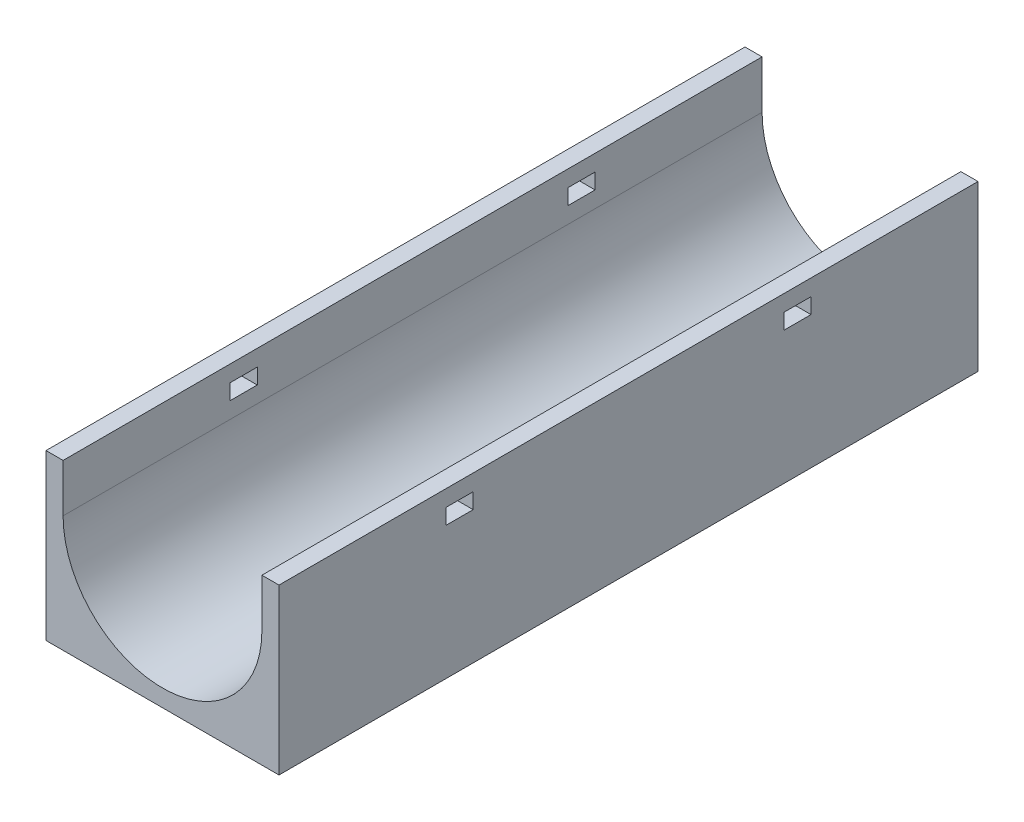
ISO-10303-21;
HEADER;
FILE_DESCRIPTION(('STEP AP214'),'2;1');
FILE_NAME('part.step','',(''),(''),'','','');
FILE_SCHEMA(('AUTOMOTIVE_DESIGN { 1 0 10303 214 1 1 1 1 }'));
ENDSEC;
DATA;
#1=APPLICATION_CONTEXT('core data for automotive mechanical design processes');
#2=APPLICATION_PROTOCOL_DEFINITION('international standard','automotive_design',2000,#1);
#3=PRODUCT_CONTEXT('',#1,'mechanical');
#4=PRODUCT('Part','Part','',(#3));
#5=PRODUCT_RELATED_PRODUCT_CATEGORY('part','',(#4));
#6=PRODUCT_DEFINITION_FORMATION('','',#4);
#7=PRODUCT_DEFINITION_CONTEXT('part definition',#1,'design');
#8=PRODUCT_DEFINITION('design','',#6,#7);
#9=PRODUCT_DEFINITION_SHAPE('','',#8);
#10=(LENGTH_UNIT() NAMED_UNIT(*) SI_UNIT(.MILLI.,.METRE.));
#11=(NAMED_UNIT(*) PLANE_ANGLE_UNIT() SI_UNIT($,.RADIAN.));
#12=(NAMED_UNIT(*) SI_UNIT($,.STERADIAN.) SOLID_ANGLE_UNIT());
#13=UNCERTAINTY_MEASURE_WITH_UNIT(LENGTH_MEASURE(1.E-05),#10,'distance_accuracy_value','');
#14=(GEOMETRIC_REPRESENTATION_CONTEXT(3) GLOBAL_UNCERTAINTY_ASSIGNED_CONTEXT((#13)) GLOBAL_UNIT_ASSIGNED_CONTEXT((#10,
#11,#12)) REPRESENTATION_CONTEXT('',''));
#15=CARTESIAN_POINT('',(0.,0.,0.));
#16=DIRECTION('',(0.,0.,1.));
#17=DIRECTION('',(1.,0.,0.));
#18=AXIS2_PLACEMENT_3D('',#15,#16,#17);
#19=CARTESIAN_POINT('',(0.,38.1,0.));
#20=DIRECTION('',(1.,0.,0.));
#21=DIRECTION('',(0.,0.,-1.));
#22=AXIS2_PLACEMENT_3D('',#19,#20,#21);
#23=PLANE('',#22);
#24=DIRECTION('',(0.,0.,-1.));
#25=VECTOR('',#24,1.);
#26=CARTESIAN_POINT('',(0.,43.4127667096147,-54.61));
#27=LINE('',#26,#25);
#28=CARTESIAN_POINT('',(0.,43.4127667096147,-54.61));
#29=VERTEX_POINT('',#28);
#30=CARTESIAN_POINT('',(0.,43.4127667096147,-63.5));
#31=VERTEX_POINT('',#30);
#32=EDGE_CURVE('E216',#29,#31,#27,.T.);
#33=ORIENTED_EDGE('',*,*,#32,.T.);
#34=DIRECTION('',(0.,1.,0.));
#35=VECTOR('',#34,1.);
#36=CARTESIAN_POINT('',(0.,48.4927667096146,-63.5));
#37=LINE('',#36,#35);
#38=CARTESIAN_POINT('',(0.,48.4927667096146,-63.5));
#39=VERTEX_POINT('',#38);
#40=EDGE_CURVE('E199',#31,#39,#37,.T.);
#41=ORIENTED_EDGE('',*,*,#40,.T.);
#42=DIRECTION('',(0.,0.,1.));
#43=VECTOR('',#42,1.);
#44=CARTESIAN_POINT('',(0.,48.4927667096146,-54.61));
#45=LINE('',#44,#43);
#46=CARTESIAN_POINT('',(0.,48.4927667096146,-54.61));
#47=VERTEX_POINT('',#46);
#48=EDGE_CURVE('E209',#39,#47,#45,.T.);
#49=ORIENTED_EDGE('',*,*,#48,.T.);
#50=DIRECTION('',(0.,-1.,0.));
#51=VECTOR('',#50,1.);
#52=CARTESIAN_POINT('',(0.,48.4927667096146,-54.61));
#53=LINE('',#52,#51);
#54=EDGE_CURVE('E47',#47,#29,#53,.T.);
#55=ORIENTED_EDGE('',*,*,#54,.T.);
#56=EDGE_LOOP('',(#33,#41,#49,#55));
#57=FACE_BOUND('',#56,.T.);
#58=DIRECTION('',(0.,1.,0.));
#59=VECTOR('',#58,1.);
#60=CARTESIAN_POINT('',(0.,48.4927667096146,-173.99));
#61=LINE('',#60,#59);
#62=CARTESIAN_POINT('',(0.,43.4127667096147,-173.99));
#63=VERTEX_POINT('',#62);
#64=CARTESIAN_POINT('',(0.,48.4927667096146,-173.99));
#65=VERTEX_POINT('',#64);
#66=EDGE_CURVE('E257',#63,#65,#61,.T.);
#67=ORIENTED_EDGE('',*,*,#66,.T.);
#68=DIRECTION('',(0.,0.,1.));
#69=VECTOR('',#68,1.);
#70=CARTESIAN_POINT('',(0.,48.4927667096146,-165.1));
#71=LINE('',#70,#69);
#72=CARTESIAN_POINT('',(0.,48.4927667096146,-165.1));
#73=VERTEX_POINT('',#72);
#74=EDGE_CURVE('E247',#65,#73,#71,.T.);
#75=ORIENTED_EDGE('',*,*,#74,.T.);
#76=DIRECTION('',(0.,-1.,0.));
#77=VECTOR('',#76,1.);
#78=CARTESIAN_POINT('',(0.,48.4927667096146,-165.1));
#79=LINE('',#78,#77);
#80=CARTESIAN_POINT('',(0.,43.4127667096147,-165.1));
#81=VERTEX_POINT('',#80);
#82=EDGE_CURVE('E250',#73,#81,#79,.T.);
#83=ORIENTED_EDGE('',*,*,#82,.T.);
#84=DIRECTION('',(0.,0.,-1.));
#85=VECTOR('',#84,1.);
#86=CARTESIAN_POINT('',(0.,43.4127667096147,-165.1));
#87=LINE('',#86,#85);
#88=EDGE_CURVE('E254',#81,#63,#87,.T.);
#89=ORIENTED_EDGE('',*,*,#88,.T.);
#90=EDGE_LOOP('',(#67,#75,#83,#89));
#91=FACE_BOUND('',#90,.T.);
#92=DIRECTION('',(0.,0.,1.));
#93=VECTOR('',#92,1.);
#94=CARTESIAN_POINT('',(0.,0.,0.));
#95=LINE('',#94,#93);
#96=CARTESIAN_POINT('',(0.,0.,-228.6));
#97=VERTEX_POINT('',#96);
#98=CARTESIAN_POINT('',(0.,0.,0.));
#99=VERTEX_POINT('',#98);
#100=EDGE_CURVE('E329',#97,#99,#95,.T.);
#101=ORIENTED_EDGE('',*,*,#100,.T.);
#102=DIRECTION('',(0.,-1.,0.));
#103=VECTOR('',#102,1.);
#104=CARTESIAN_POINT('',(0.,38.1,0.));
#105=LINE('',#104,#103);
#106=CARTESIAN_POINT('',(0.,53.8055334192293,0.));
#107=VERTEX_POINT('',#106);
#108=EDGE_CURVE('E348',#107,#99,#105,.T.);
#109=ORIENTED_EDGE('',*,*,#108,.F.);
#110=DIRECTION('',(0.,0.,1.));
#111=VECTOR('',#110,1.);
#112=CARTESIAN_POINT('',(0.,53.8055334192293,-245.270018715722));
#113=LINE('',#112,#111);
#114=CARTESIAN_POINT('',(0.,53.8055334192293,-228.6));
#115=VERTEX_POINT('',#114);
#116=EDGE_CURVE('E314',#115,#107,#113,.T.);
#117=ORIENTED_EDGE('',*,*,#116,.F.);
#118=DIRECTION('',(0.,-1.,0.));
#119=VECTOR('',#118,1.);
#120=CARTESIAN_POINT('',(0.,38.1,-228.6));
#121=LINE('',#120,#119);
#122=EDGE_CURVE('E339',#115,#97,#121,.T.);
#123=ORIENTED_EDGE('',*,*,#122,.T.);
#124=EDGE_LOOP('',(#101,#109,#117,#123));
#125=FACE_BOUND('',#124,.T.);
#126=ADVANCED_FACE('F33',(#57,#91,#125),#23,.F.);
#127=CARTESIAN_POINT('',(0.,38.1,0.));
#128=DIRECTION('',(0.,0.,-1.));
#129=DIRECTION('',(-1.,0.,0.));
#130=AXIS2_PLACEMENT_3D('',#127,#128,#129);
#131=PLANE('',#130);
#132=DIRECTION('',(0.,-1.,0.));
#133=VECTOR('',#132,1.);
#134=CARTESIAN_POINT('',(76.2,38.1,0.));
#135=LINE('',#134,#133);
#136=CARTESIAN_POINT('',(76.2,53.8055334192293,0.));
#137=VERTEX_POINT('',#136);
#138=CARTESIAN_POINT('',(76.2,0.,0.));
#139=VERTEX_POINT('',#138);
#140=EDGE_CURVE('E345',#137,#139,#135,.T.);
#141=ORIENTED_EDGE('',*,*,#140,.F.);
#142=DIRECTION('',(-1.,0.,0.));
#143=VECTOR('',#142,1.);
#144=CARTESIAN_POINT('',(70.612,53.8055334192293,0.));
#145=LINE('',#144,#143);
#146=CARTESIAN_POINT('',(70.612,53.8055334192293,0.));
#147=VERTEX_POINT('',#146);
#148=EDGE_CURVE('E303',#137,#147,#145,.T.);
#149=ORIENTED_EDGE('',*,*,#148,.T.);
#150=DIRECTION('',(0.,-1.,0.));
#151=VECTOR('',#150,1.);
#152=CARTESIAN_POINT('',(70.612,38.1,0.));
#153=LINE('',#152,#151);
#154=CARTESIAN_POINT('',(70.612,38.1,0.));
#155=VERTEX_POINT('',#154);
#156=EDGE_CURVE('E293',#147,#155,#153,.T.);
#157=ORIENTED_EDGE('',*,*,#156,.T.);
#158=CARTESIAN_POINT('',(38.1,38.1,0.));
#159=DIRECTION('',(0.,0.,1.));
#160=DIRECTION('',(1.,0.,0.));
#161=AXIS2_PLACEMENT_3D('',#158,#159,#160);
#162=CIRCLE('',#161,32.512);
#163=CARTESIAN_POINT('',(5.58800000000003,38.1,0.));
#164=VERTEX_POINT('',#163);
#165=EDGE_CURVE('E316',#164,#155,#162,.T.);
#166=ORIENTED_EDGE('',*,*,#165,.F.);
#167=DIRECTION('',(0.,1.,0.));
#168=VECTOR('',#167,1.);
#169=CARTESIAN_POINT('',(5.58800000000003,38.1,0.));
#170=LINE('',#169,#168);
#171=CARTESIAN_POINT('',(5.58800000000003,53.8055334192293,0.));
#172=VERTEX_POINT('',#171);
#173=EDGE_CURVE('E300',#164,#172,#170,.T.);
#174=ORIENTED_EDGE('',*,*,#173,.T.);
#175=DIRECTION('',(-1.,0.,0.));
#176=VECTOR('',#175,1.);
#177=CARTESIAN_POINT('',(0.,53.8055334192293,0.));
#178=LINE('',#177,#176);
#179=EDGE_CURVE('E319',#172,#107,#178,.T.);
#180=ORIENTED_EDGE('',*,*,#179,.T.);
#181=ORIENTED_EDGE('',*,*,#108,.T.);
#182=DIRECTION('',(1.,0.,0.));
#183=VECTOR('',#182,1.);
#184=CARTESIAN_POINT('',(0.,0.,0.));
#185=LINE('',#184,#183);
#186=EDGE_CURVE('E333',#99,#139,#185,.T.);
#187=ORIENTED_EDGE('',*,*,#186,.T.);
#188=EDGE_LOOP('',(#141,#149,#157,#166,#174,#180,#181,#187));
#189=FACE_BOUND('',#188,.T.);
#190=ADVANCED_FACE('F394',(#189),#131,.F.);
#191=CARTESIAN_POINT('',(76.2,38.1,0.));
#192=DIRECTION('',(-1.,0.,0.));
#193=DIRECTION('',(0.,0.,1.));
#194=AXIS2_PLACEMENT_3D('',#191,#192,#193);
#195=PLANE('',#194);
#196=DIRECTION('',(0.,0.,1.));
#197=VECTOR('',#196,1.);
#198=CARTESIAN_POINT('',(76.2,48.4927667096146,-54.61));
#199=LINE('',#198,#197);
#200=CARTESIAN_POINT('',(76.2,48.4927667096146,-63.5));
#201=VERTEX_POINT('',#200);
#202=CARTESIAN_POINT('',(76.2,48.4927667096146,-54.61));
#203=VERTEX_POINT('',#202);
#204=EDGE_CURVE('E226',#201,#203,#199,.T.);
#205=ORIENTED_EDGE('',*,*,#204,.F.);
#206=DIRECTION('',(0.,1.,0.));
#207=VECTOR('',#206,1.);
#208=CARTESIAN_POINT('',(76.2,48.4927667096146,-63.5));
#209=LINE('',#208,#207);
#210=CARTESIAN_POINT('',(76.2,43.4127667096147,-63.5));
#211=VERTEX_POINT('',#210);
#212=EDGE_CURVE('E55',#211,#201,#209,.T.);
#213=ORIENTED_EDGE('',*,*,#212,.F.);
#214=DIRECTION('',(0.,0.,-1.));
#215=VECTOR('',#214,1.);
#216=CARTESIAN_POINT('',(76.2,43.4127667096147,-54.61));
#217=LINE('',#216,#215);
#218=CARTESIAN_POINT('',(76.2,43.4127667096147,-54.61));
#219=VERTEX_POINT('',#218);
#220=EDGE_CURVE('E217',#219,#211,#217,.T.);
#221=ORIENTED_EDGE('',*,*,#220,.F.);
#222=DIRECTION('',(0.,-1.,0.));
#223=VECTOR('',#222,1.);
#224=CARTESIAN_POINT('',(76.2,48.4927667096146,-54.61));
#225=LINE('',#224,#223);
#226=EDGE_CURVE('E220',#203,#219,#225,.T.);
#227=ORIENTED_EDGE('',*,*,#226,.F.);
#228=EDGE_LOOP('',(#205,#213,#221,#227));
#229=FACE_BOUND('',#228,.T.);
#230=DIRECTION('',(0.,-1.,0.));
#231=VECTOR('',#230,1.);
#232=CARTESIAN_POINT('',(76.2,48.4927667096146,-165.1));
#233=LINE('',#232,#231);
#234=CARTESIAN_POINT('',(76.2,48.4927667096146,-165.1));
#235=VERTEX_POINT('',#234);
#236=CARTESIAN_POINT('',(76.2,43.4127667096147,-165.1));
#237=VERTEX_POINT('',#236);
#238=EDGE_CURVE('E262',#235,#237,#233,.T.);
#239=ORIENTED_EDGE('',*,*,#238,.F.);
#240=DIRECTION('',(0.,0.,1.));
#241=VECTOR('',#240,1.);
#242=CARTESIAN_POINT('',(76.2,48.4927667096146,-165.1));
#243=LINE('',#242,#241);
#244=CARTESIAN_POINT('',(76.2,48.4927667096146,-173.99));
#245=VERTEX_POINT('',#244);
#246=EDGE_CURVE('E246',#245,#235,#243,.T.);
#247=ORIENTED_EDGE('',*,*,#246,.F.);
#248=DIRECTION('',(0.,1.,0.));
#249=VECTOR('',#248,1.);
#250=CARTESIAN_POINT('',(76.2,48.4927667096146,-173.99));
#251=LINE('',#250,#249);
#252=CARTESIAN_POINT('',(76.2,43.4127667096147,-173.99));
#253=VERTEX_POINT('',#252);
#254=EDGE_CURVE('E251',#253,#245,#251,.T.);
#255=ORIENTED_EDGE('',*,*,#254,.F.);
#256=DIRECTION('',(0.,0.,-1.));
#257=VECTOR('',#256,1.);
#258=CARTESIAN_POINT('',(76.2,43.4127667096147,-165.1));
#259=LINE('',#258,#257);
#260=EDGE_CURVE('E265',#237,#253,#259,.T.);
#261=ORIENTED_EDGE('',*,*,#260,.F.);
#262=EDGE_LOOP('',(#239,#247,#255,#261));
#263=FACE_BOUND('',#262,.T.);
#264=DIRECTION('',(0.,0.,-1.));
#265=VECTOR('',#264,1.);
#266=CARTESIAN_POINT('',(76.2,0.,0.));
#267=LINE('',#266,#265);
#268=CARTESIAN_POINT('',(76.2,0.,-228.6));
#269=VERTEX_POINT('',#268);
#270=EDGE_CURVE('E335',#139,#269,#267,.T.);
#271=ORIENTED_EDGE('',*,*,#270,.T.);
#272=DIRECTION('',(0.,-1.,0.));
#273=VECTOR('',#272,1.);
#274=CARTESIAN_POINT('',(76.2,38.1,-228.6));
#275=LINE('',#274,#273);
#276=CARTESIAN_POINT('',(76.2,53.8055334192293,-228.6));
#277=VERTEX_POINT('',#276);
#278=EDGE_CURVE('E342',#277,#269,#275,.T.);
#279=ORIENTED_EDGE('',*,*,#278,.F.);
#280=DIRECTION('',(0.,0.,1.));
#281=VECTOR('',#280,1.);
#282=CARTESIAN_POINT('',(76.2,53.8055334192293,-245.270018715722));
#283=LINE('',#282,#281);
#284=EDGE_CURVE('E306',#277,#137,#283,.T.);
#285=ORIENTED_EDGE('',*,*,#284,.T.);
#286=ORIENTED_EDGE('',*,*,#140,.T.);
#287=EDGE_LOOP('',(#271,#279,#285,#286));
#288=FACE_BOUND('',#287,.T.);
#289=ADVANCED_FACE('F390',(#229,#263,#288),#195,.F.);
#290=CARTESIAN_POINT('',(0.,38.1,-228.6));
#291=DIRECTION('',(0.,0.,1.));
#292=DIRECTION('',(1.,0.,0.));
#293=AXIS2_PLACEMENT_3D('',#290,#291,#292);
#294=PLANE('',#293);
#295=ORIENTED_EDGE('',*,*,#122,.F.);
#296=DIRECTION('',(1.,0.,0.));
#297=VECTOR('',#296,1.);
#298=CARTESIAN_POINT('',(0.,53.8055334192293,-228.6));
#299=LINE('',#298,#297);
#300=CARTESIAN_POINT('',(5.58800000000003,53.8055334192293,-228.6));
#301=VERTEX_POINT('',#300);
#302=EDGE_CURVE('E313',#115,#301,#299,.T.);
#303=ORIENTED_EDGE('',*,*,#302,.T.);
#304=DIRECTION('',(0.,-1.,0.));
#305=VECTOR('',#304,1.);
#306=CARTESIAN_POINT('',(5.58800000000003,38.1,-228.6));
#307=LINE('',#306,#305);
#308=CARTESIAN_POINT('',(5.58800000000003,38.1,-228.6));
#309=VERTEX_POINT('',#308);
#310=EDGE_CURVE('E310',#301,#309,#307,.T.);
#311=ORIENTED_EDGE('',*,*,#310,.T.);
#312=CARTESIAN_POINT('',(38.1,38.1,-228.6));
#313=DIRECTION('',(0.,0.,1.));
#314=DIRECTION('',(1.,0.,0.));
#315=AXIS2_PLACEMENT_3D('',#312,#313,#314);
#316=CIRCLE('',#315,32.512);
#317=CARTESIAN_POINT('',(70.612,38.1,-228.6));
#318=VERTEX_POINT('',#317);
#319=EDGE_CURVE('E326',#309,#318,#316,.T.);
#320=ORIENTED_EDGE('',*,*,#319,.T.);
#321=DIRECTION('',(0.,1.,0.));
#322=VECTOR('',#321,1.);
#323=CARTESIAN_POINT('',(70.612,38.1,-228.6));
#324=LINE('',#323,#322);
#325=CARTESIAN_POINT('',(70.612,53.8055334192293,-228.6));
#326=VERTEX_POINT('',#325);
#327=EDGE_CURVE('E297',#318,#326,#324,.T.);
#328=ORIENTED_EDGE('',*,*,#327,.T.);
#329=DIRECTION('',(1.,0.,0.));
#330=VECTOR('',#329,1.);
#331=CARTESIAN_POINT('',(70.612,53.8055334192293,-228.6));
#332=LINE('',#331,#330);
#333=EDGE_CURVE('E294',#326,#277,#332,.T.);
#334=ORIENTED_EDGE('',*,*,#333,.T.);
#335=ORIENTED_EDGE('',*,*,#278,.T.);
#336=DIRECTION('',(-1.,0.,0.));
#337=VECTOR('',#336,1.);
#338=CARTESIAN_POINT('',(0.,0.,-228.6));
#339=LINE('',#338,#337);
#340=EDGE_CURVE('E337',#269,#97,#339,.T.);
#341=ORIENTED_EDGE('',*,*,#340,.T.);
#342=EDGE_LOOP('',(#295,#303,#311,#320,#328,#334,#335,#341));
#343=FACE_BOUND('',#342,.T.);
#344=ADVANCED_FACE('F393',(#343),#294,.F.);
#345=CARTESIAN_POINT('',(0.,0.,0.));
#346=DIRECTION('',(0.,-1.,0.));
#347=DIRECTION('',(0.,0.,-1.));
#348=AXIS2_PLACEMENT_3D('',#345,#346,#347);
#349=PLANE('',#348);
#350=ORIENTED_EDGE('',*,*,#100,.F.);
#351=ORIENTED_EDGE('',*,*,#340,.F.);
#352=ORIENTED_EDGE('',*,*,#270,.F.);
#353=ORIENTED_EDGE('',*,*,#186,.F.);
#354=EDGE_LOOP('',(#350,#351,#352,#353));
#355=FACE_BOUND('',#354,.T.);
#356=ADVANCED_FACE('F407',(#355),#349,.T.);
#357=CARTESIAN_POINT('',(38.1,38.1,-228.6));
#358=DIRECTION('',(0.,0.,1.));
#359=DIRECTION('',(1.,0.,0.));
#360=AXIS2_PLACEMENT_3D('',#357,#358,#359);
#361=CYLINDRICAL_SURFACE('',#360,32.512);
#362=ORIENTED_EDGE('',*,*,#319,.F.);
#363=DIRECTION('',(0.,0.,1.));
#364=VECTOR('',#363,1.);
#365=CARTESIAN_POINT('',(5.58800000000003,38.1,-228.6));
#366=LINE('',#365,#364);
#367=EDGE_CURVE('E351',#164,#309,#366,.F.);
#368=ORIENTED_EDGE('',*,*,#367,.F.);
#369=ORIENTED_EDGE('',*,*,#165,.T.);
#370=DIRECTION('',(0.,0.,1.));
#371=VECTOR('',#370,1.);
#372=CARTESIAN_POINT('',(70.612,38.1,-228.6));
#373=LINE('',#372,#371);
#374=EDGE_CURVE('E354',#318,#155,#373,.T.);
#375=ORIENTED_EDGE('',*,*,#374,.F.);
#376=EDGE_LOOP('',(#362,#368,#369,#375));
#377=FACE_BOUND('',#376,.T.);
#378=ADVANCED_FACE('F423',(#377),#361,.F.);
#379=CARTESIAN_POINT('',(0.,53.8055334192293,-245.270018715722));
#380=DIRECTION('',(0.,1.,0.));
#381=DIRECTION('',(0.,0.,1.));
#382=AXIS2_PLACEMENT_3D('',#379,#380,#381);
#383=PLANE('',#382);
#384=ORIENTED_EDGE('',*,*,#302,.F.);
#385=ORIENTED_EDGE('',*,*,#116,.T.);
#386=ORIENTED_EDGE('',*,*,#179,.F.);
#387=DIRECTION('',(0.,0.,1.));
#388=VECTOR('',#387,1.);
#389=CARTESIAN_POINT('',(5.58800000000003,53.8055334192293,-245.270018715722));
#390=LINE('',#389,#388);
#391=EDGE_CURVE('E322',#301,#172,#390,.T.);
#392=ORIENTED_EDGE('',*,*,#391,.F.);
#393=EDGE_LOOP('',(#384,#385,#386,#392));
#394=FACE_BOUND('',#393,.T.);
#395=ADVANCED_FACE('F414',(#394),#383,.T.);
#396=CARTESIAN_POINT('',(5.58800000000003,38.1,-245.270018715722));
#397=DIRECTION('',(1.,0.,0.));
#398=DIRECTION('',(0.,0.,-1.));
#399=AXIS2_PLACEMENT_3D('',#396,#397,#398);
#400=PLANE('',#399);
#401=DIRECTION('',(0.,1.,0.));
#402=VECTOR('',#401,1.);
#403=CARTESIAN_POINT('',(5.58800000000003,38.1,-63.5));
#404=LINE('',#403,#402);
#405=CARTESIAN_POINT('',(5.58800000000003,43.4127667096147,-63.5));
#406=VERTEX_POINT('',#405);
#407=CARTESIAN_POINT('',(5.58800000000003,48.4927667096146,-63.5));
#408=VERTEX_POINT('',#407);
#409=EDGE_CURVE('E202',#406,#408,#404,.T.);
#410=ORIENTED_EDGE('',*,*,#409,.F.);
#411=DIRECTION('',(0.,0.,-1.));
#412=VECTOR('',#411,1.);
#413=CARTESIAN_POINT('',(5.58800000000003,43.4127667096147,-245.270018715722));
#414=LINE('',#413,#412);
#415=CARTESIAN_POINT('',(5.58800000000003,43.4127667096147,-54.61));
#416=VERTEX_POINT('',#415);
#417=EDGE_CURVE('E243',#416,#406,#414,.T.);
#418=ORIENTED_EDGE('',*,*,#417,.F.);
#419=DIRECTION('',(0.,-1.,0.));
#420=VECTOR('',#419,1.);
#421=CARTESIAN_POINT('',(5.58800000000003,38.1,-54.61));
#422=LINE('',#421,#420);
#423=CARTESIAN_POINT('',(5.58800000000003,48.4927667096146,-54.61));
#424=VERTEX_POINT('',#423);
#425=EDGE_CURVE('E241',#424,#416,#422,.T.);
#426=ORIENTED_EDGE('',*,*,#425,.F.);
#427=DIRECTION('',(0.,0.,1.));
#428=VECTOR('',#427,1.);
#429=CARTESIAN_POINT('',(5.58800000000003,48.4927667096146,-245.270018715722));
#430=LINE('',#429,#428);
#431=EDGE_CURVE('E233',#408,#424,#430,.T.);
#432=ORIENTED_EDGE('',*,*,#431,.F.);
#433=EDGE_LOOP('',(#410,#418,#426,#432));
#434=FACE_BOUND('',#433,.T.);
#435=DIRECTION('',(0.,0.,1.));
#436=VECTOR('',#435,1.);
#437=CARTESIAN_POINT('',(5.58800000000003,48.4927667096146,-245.270018715722));
#438=LINE('',#437,#436);
#439=CARTESIAN_POINT('',(5.58800000000003,48.4927667096146,-173.99));
#440=VERTEX_POINT('',#439);
#441=CARTESIAN_POINT('',(5.58800000000003,48.4927667096146,-165.1));
#442=VERTEX_POINT('',#441);
#443=EDGE_CURVE('E290',#440,#442,#438,.T.);
#444=ORIENTED_EDGE('',*,*,#443,.F.);
#445=DIRECTION('',(0.,1.,0.));
#446=VECTOR('',#445,1.);
#447=CARTESIAN_POINT('',(5.58800000000003,38.1,-173.99));
#448=LINE('',#447,#446);
#449=CARTESIAN_POINT('',(5.58800000000003,43.4127667096147,-173.99));
#450=VERTEX_POINT('',#449);
#451=EDGE_CURVE('E288',#450,#440,#448,.T.);
#452=ORIENTED_EDGE('',*,*,#451,.F.);
#453=DIRECTION('',(0.,0.,-1.));
#454=VECTOR('',#453,1.);
#455=CARTESIAN_POINT('',(5.58800000000003,43.4127667096147,-245.270018715722));
#456=LINE('',#455,#454);
#457=CARTESIAN_POINT('',(5.58800000000003,43.4127667096147,-165.1));
#458=VERTEX_POINT('',#457);
#459=EDGE_CURVE('E286',#458,#450,#456,.T.);
#460=ORIENTED_EDGE('',*,*,#459,.F.);
#461=DIRECTION('',(0.,-1.,0.));
#462=VECTOR('',#461,1.);
#463=CARTESIAN_POINT('',(5.58800000000003,38.1,-165.1));
#464=LINE('',#463,#462);
#465=EDGE_CURVE('E273',#442,#458,#464,.T.);
#466=ORIENTED_EDGE('',*,*,#465,.F.);
#467=EDGE_LOOP('',(#444,#452,#460,#466));
#468=FACE_BOUND('',#467,.T.);
#469=ORIENTED_EDGE('',*,*,#310,.F.);
#470=ORIENTED_EDGE('',*,*,#391,.T.);
#471=ORIENTED_EDGE('',*,*,#173,.F.);
#472=ORIENTED_EDGE('',*,*,#367,.T.);
#473=EDGE_LOOP('',(#469,#470,#471,#472));
#474=FACE_BOUND('',#473,.T.);
#475=ADVANCED_FACE('F418',(#434,#468,#474),#400,.T.);
#476=CARTESIAN_POINT('',(70.612,38.1,-245.270018715722));
#477=DIRECTION('',(-1.,0.,0.));
#478=DIRECTION('',(0.,0.,1.));
#479=AXIS2_PLACEMENT_3D('',#476,#477,#478);
#480=PLANE('',#479);
#481=DIRECTION('',(0.,-1.,0.));
#482=VECTOR('',#481,1.);
#483=CARTESIAN_POINT('',(70.612,38.1,-63.5));
#484=LINE('',#483,#482);
#485=CARTESIAN_POINT('',(70.612,48.4927667096146,-63.5));
#486=VERTEX_POINT('',#485);
#487=CARTESIAN_POINT('',(70.612,43.4127667096147,-63.5));
#488=VERTEX_POINT('',#487);
#489=EDGE_CURVE('E11',#486,#488,#484,.T.);
#490=ORIENTED_EDGE('',*,*,#489,.F.);
#491=DIRECTION('',(0.,0.,-1.));
#492=VECTOR('',#491,1.);
#493=CARTESIAN_POINT('',(70.612,48.4927667096146,-245.270018715722));
#494=LINE('',#493,#492);
#495=CARTESIAN_POINT('',(70.612,48.4927667096146,-54.61));
#496=VERTEX_POINT('',#495);
#497=EDGE_CURVE('E366',#496,#486,#494,.T.);
#498=ORIENTED_EDGE('',*,*,#497,.F.);
#499=DIRECTION('',(0.,1.,0.));
#500=VECTOR('',#499,1.);
#501=CARTESIAN_POINT('',(70.612,38.1,-54.61));
#502=LINE('',#501,#500);
#503=CARTESIAN_POINT('',(70.612,43.4127667096147,-54.61));
#504=VERTEX_POINT('',#503);
#505=EDGE_CURVE('E368',#504,#496,#502,.T.);
#506=ORIENTED_EDGE('',*,*,#505,.F.);
#507=DIRECTION('',(0.,0.,1.));
#508=VECTOR('',#507,1.);
#509=CARTESIAN_POINT('',(70.612,43.4127667096147,-245.270018715722));
#510=LINE('',#509,#508);
#511=EDGE_CURVE('E40',#488,#504,#510,.T.);
#512=ORIENTED_EDGE('',*,*,#511,.F.);
#513=EDGE_LOOP('',(#490,#498,#506,#512));
#514=FACE_BOUND('',#513,.T.);
#515=DIRECTION('',(0.,0.,-1.));
#516=VECTOR('',#515,1.);
#517=CARTESIAN_POINT('',(70.612,48.4927667096146,-245.270018715722));
#518=LINE('',#517,#516);
#519=CARTESIAN_POINT('',(70.612,48.4927667096146,-165.1));
#520=VERTEX_POINT('',#519);
#521=CARTESIAN_POINT('',(70.612,48.4927667096146,-173.99));
#522=VERTEX_POINT('',#521);
#523=EDGE_CURVE('E364',#520,#522,#518,.T.);
#524=ORIENTED_EDGE('',*,*,#523,.F.);
#525=DIRECTION('',(0.,1.,0.));
#526=VECTOR('',#525,1.);
#527=CARTESIAN_POINT('',(70.612,38.1,-165.1));
#528=LINE('',#527,#526);
#529=CARTESIAN_POINT('',(70.612,43.4127667096147,-165.1));
#530=VERTEX_POINT('',#529);
#531=EDGE_CURVE('E357',#530,#520,#528,.T.);
#532=ORIENTED_EDGE('',*,*,#531,.F.);
#533=DIRECTION('',(0.,0.,1.));
#534=VECTOR('',#533,1.);
#535=CARTESIAN_POINT('',(70.612,43.4127667096147,-245.270018715722));
#536=LINE('',#535,#534);
#537=CARTESIAN_POINT('',(70.612,43.4127667096147,-173.99));
#538=VERTEX_POINT('',#537);
#539=EDGE_CURVE('E359',#538,#530,#536,.T.);
#540=ORIENTED_EDGE('',*,*,#539,.F.);
#541=DIRECTION('',(0.,-1.,0.));
#542=VECTOR('',#541,1.);
#543=CARTESIAN_POINT('',(70.612,38.1,-173.99));
#544=LINE('',#543,#542);
#545=EDGE_CURVE('E362',#522,#538,#544,.T.);
#546=ORIENTED_EDGE('',*,*,#545,.F.);
#547=EDGE_LOOP('',(#524,#532,#540,#546));
#548=FACE_BOUND('',#547,.T.);
#549=ORIENTED_EDGE('',*,*,#327,.F.);
#550=ORIENTED_EDGE('',*,*,#374,.T.);
#551=ORIENTED_EDGE('',*,*,#156,.F.);
#552=DIRECTION('',(0.,0.,1.));
#553=VECTOR('',#552,1.);
#554=CARTESIAN_POINT('',(70.612,53.8055334192293,-245.270018715722));
#555=LINE('',#554,#553);
#556=EDGE_CURVE('E298',#326,#147,#555,.T.);
#557=ORIENTED_EDGE('',*,*,#556,.F.);
#558=EDGE_LOOP('',(#549,#550,#551,#557));
#559=FACE_BOUND('',#558,.T.);
#560=ADVANCED_FACE('F383',(#514,#548,#559),#480,.T.);
#561=CARTESIAN_POINT('',(70.612,53.8055334192293,-245.270018715722));
#562=DIRECTION('',(0.,1.,0.));
#563=DIRECTION('',(0.,0.,1.));
#564=AXIS2_PLACEMENT_3D('',#561,#562,#563);
#565=PLANE('',#564);
#566=ORIENTED_EDGE('',*,*,#333,.F.);
#567=ORIENTED_EDGE('',*,*,#556,.T.);
#568=ORIENTED_EDGE('',*,*,#148,.F.);
#569=ORIENTED_EDGE('',*,*,#284,.F.);
#570=EDGE_LOOP('',(#566,#567,#568,#569));
#571=FACE_BOUND('',#570,.T.);
#572=ADVANCED_FACE('F428',(#571),#565,.T.);
#573=CARTESIAN_POINT('',(0.,48.4927667096146,-165.1));
#574=DIRECTION('',(0.,0.,1.));
#575=DIRECTION('',(1.,0.,0.));
#576=AXIS2_PLACEMENT_3D('',#573,#574,#575);
#577=PLANE('',#576);
#578=ORIENTED_EDGE('',*,*,#531,.T.);
#579=DIRECTION('',(1.,0.,0.));
#580=VECTOR('',#579,1.);
#581=CARTESIAN_POINT('',(0.,48.4927667096146,-165.1));
#582=LINE('',#581,#580);
#583=EDGE_CURVE('E260',#520,#235,#582,.T.);
#584=ORIENTED_EDGE('',*,*,#583,.T.);
#585=ORIENTED_EDGE('',*,*,#238,.T.);
#586=DIRECTION('',(1.,0.,0.));
#587=VECTOR('',#586,1.);
#588=CARTESIAN_POINT('',(0.,43.4127667096147,-165.1));
#589=LINE('',#588,#587);
#590=EDGE_CURVE('E282',#530,#237,#589,.T.);
#591=ORIENTED_EDGE('',*,*,#590,.F.);
#592=EDGE_LOOP('',(#578,#584,#585,#591));
#593=FACE_BOUND('',#592,.T.);
#594=ADVANCED_FACE('F431',(#593),#577,.F.);
#595=CARTESIAN_POINT('',(0.,43.4127667096147,-165.1));
#596=DIRECTION('',(0.,-1.,0.));
#597=DIRECTION('',(0.,0.,-1.));
#598=AXIS2_PLACEMENT_3D('',#595,#596,#597);
#599=PLANE('',#598);
#600=ORIENTED_EDGE('',*,*,#539,.T.);
#601=ORIENTED_EDGE('',*,*,#590,.T.);
#602=ORIENTED_EDGE('',*,*,#260,.T.);
#603=DIRECTION('',(1.,0.,0.));
#604=VECTOR('',#603,1.);
#605=CARTESIAN_POINT('',(0.,43.4127667096147,-173.99));
#606=LINE('',#605,#604);
#607=EDGE_CURVE('E278',#538,#253,#606,.T.);
#608=ORIENTED_EDGE('',*,*,#607,.F.);
#609=EDGE_LOOP('',(#600,#601,#602,#608));
#610=FACE_BOUND('',#609,.T.);
#611=ADVANCED_FACE('F437',(#610),#599,.F.);
#612=CARTESIAN_POINT('',(0.,48.4927667096146,-173.99));
#613=DIRECTION('',(0.,0.,-1.));
#614=DIRECTION('',(-1.,0.,0.));
#615=AXIS2_PLACEMENT_3D('',#612,#613,#614);
#616=PLANE('',#615);
#617=ORIENTED_EDGE('',*,*,#545,.T.);
#618=ORIENTED_EDGE('',*,*,#607,.T.);
#619=ORIENTED_EDGE('',*,*,#254,.T.);
#620=DIRECTION('',(1.,0.,0.));
#621=VECTOR('',#620,1.);
#622=CARTESIAN_POINT('',(0.,48.4927667096146,-173.99));
#623=LINE('',#622,#621);
#624=EDGE_CURVE('E274',#522,#245,#623,.T.);
#625=ORIENTED_EDGE('',*,*,#624,.F.);
#626=EDGE_LOOP('',(#617,#618,#619,#625));
#627=FACE_BOUND('',#626,.T.);
#628=ADVANCED_FACE('F489',(#627),#616,.F.);
#629=CARTESIAN_POINT('',(0.,48.4927667096146,-165.1));
#630=DIRECTION('',(0.,1.,0.));
#631=DIRECTION('',(0.,0.,1.));
#632=AXIS2_PLACEMENT_3D('',#629,#630,#631);
#633=PLANE('',#632);
#634=ORIENTED_EDGE('',*,*,#523,.T.);
#635=ORIENTED_EDGE('',*,*,#624,.T.);
#636=ORIENTED_EDGE('',*,*,#246,.T.);
#637=ORIENTED_EDGE('',*,*,#583,.F.);
#638=EDGE_LOOP('',(#634,#635,#636,#637));
#639=FACE_BOUND('',#638,.T.);
#640=ADVANCED_FACE('F500',(#639),#633,.F.);
#641=ORIENTED_EDGE('',*,*,#443,.T.);
#642=EDGE_CURVE('E283',#73,#442,#582,.T.);
#643=ORIENTED_EDGE('',*,*,#642,.F.);
#644=ORIENTED_EDGE('',*,*,#74,.F.);
#645=EDGE_CURVE('E270',#65,#440,#623,.T.);
#646=ORIENTED_EDGE('',*,*,#645,.T.);
#647=EDGE_LOOP('',(#641,#643,#644,#646));
#648=FACE_BOUND('',#647,.T.);
#649=ADVANCED_FACE('F511',(#648),#633,.F.);
#650=ORIENTED_EDGE('',*,*,#451,.T.);
#651=ORIENTED_EDGE('',*,*,#645,.F.);
#652=ORIENTED_EDGE('',*,*,#66,.F.);
#653=EDGE_CURVE('E275',#63,#450,#606,.T.);
#654=ORIENTED_EDGE('',*,*,#653,.T.);
#655=EDGE_LOOP('',(#650,#651,#652,#654));
#656=FACE_BOUND('',#655,.T.);
#657=ADVANCED_FACE('F503',(#656),#616,.F.);
#658=ORIENTED_EDGE('',*,*,#459,.T.);
#659=ORIENTED_EDGE('',*,*,#653,.F.);
#660=ORIENTED_EDGE('',*,*,#88,.F.);
#661=EDGE_CURVE('E279',#81,#458,#589,.T.);
#662=ORIENTED_EDGE('',*,*,#661,.T.);
#663=EDGE_LOOP('',(#658,#659,#660,#662));
#664=FACE_BOUND('',#663,.T.);
#665=ADVANCED_FACE('F492',(#664),#599,.F.);
#666=ORIENTED_EDGE('',*,*,#465,.T.);
#667=ORIENTED_EDGE('',*,*,#661,.F.);
#668=ORIENTED_EDGE('',*,*,#82,.F.);
#669=ORIENTED_EDGE('',*,*,#642,.T.);
#670=EDGE_LOOP('',(#666,#667,#668,#669));
#671=FACE_BOUND('',#670,.T.);
#672=ADVANCED_FACE('F440',(#671),#577,.F.);
#673=CARTESIAN_POINT('',(0.,48.4927667096146,-54.61));
#674=DIRECTION('',(0.,1.,0.));
#675=DIRECTION('',(0.,0.,1.));
#676=AXIS2_PLACEMENT_3D('',#673,#674,#675);
#677=PLANE('',#676);
#678=ORIENTED_EDGE('',*,*,#497,.T.);
#679=DIRECTION('',(1.,0.,0.));
#680=VECTOR('',#679,1.);
#681=CARTESIAN_POINT('',(0.,48.4927667096146,-63.5));
#682=LINE('',#681,#680);
#683=EDGE_CURVE('E206',#486,#201,#682,.T.);
#684=ORIENTED_EDGE('',*,*,#683,.T.);
#685=ORIENTED_EDGE('',*,*,#204,.T.);
#686=DIRECTION('',(1.,0.,0.));
#687=VECTOR('',#686,1.);
#688=CARTESIAN_POINT('',(0.,48.4927667096146,-54.61));
#689=LINE('',#688,#687);
#690=EDGE_CURVE('E205',#496,#203,#689,.T.);
#691=ORIENTED_EDGE('',*,*,#690,.F.);
#692=EDGE_LOOP('',(#678,#684,#685,#691));
#693=FACE_BOUND('',#692,.T.);
#694=ADVANCED_FACE('F386',(#693),#677,.F.);
#695=CARTESIAN_POINT('',(0.,48.4927667096146,-54.61));
#696=DIRECTION('',(0.,0.,1.));
#697=DIRECTION('',(1.,0.,0.));
#698=AXIS2_PLACEMENT_3D('',#695,#696,#697);
#699=PLANE('',#698);
#700=ORIENTED_EDGE('',*,*,#505,.T.);
#701=ORIENTED_EDGE('',*,*,#690,.T.);
#702=ORIENTED_EDGE('',*,*,#226,.T.);
#703=DIRECTION('',(1.,0.,0.));
#704=VECTOR('',#703,1.);
#705=CARTESIAN_POINT('',(0.,43.4127667096147,-54.61));
#706=LINE('',#705,#704);
#707=EDGE_CURVE('E238',#504,#219,#706,.T.);
#708=ORIENTED_EDGE('',*,*,#707,.F.);
#709=EDGE_LOOP('',(#700,#701,#702,#708));
#710=FACE_BOUND('',#709,.T.);
#711=ADVANCED_FACE('F379',(#710),#699,.F.);
#712=CARTESIAN_POINT('',(0.,43.4127667096147,-54.61));
#713=DIRECTION('',(0.,-1.,0.));
#714=DIRECTION('',(0.,0.,-1.));
#715=AXIS2_PLACEMENT_3D('',#712,#713,#714);
#716=PLANE('',#715);
#717=ORIENTED_EDGE('',*,*,#511,.T.);
#718=ORIENTED_EDGE('',*,*,#707,.T.);
#719=ORIENTED_EDGE('',*,*,#220,.T.);
#720=DIRECTION('',(1.,0.,0.));
#721=VECTOR('',#720,1.);
#722=CARTESIAN_POINT('',(0.,43.4127667096147,-63.5));
#723=LINE('',#722,#721);
#724=EDGE_CURVE('E234',#488,#211,#723,.T.);
#725=ORIENTED_EDGE('',*,*,#724,.F.);
#726=EDGE_LOOP('',(#717,#718,#719,#725));
#727=FACE_BOUND('',#726,.T.);
#728=ADVANCED_FACE('F374',(#727),#716,.F.);
#729=CARTESIAN_POINT('',(0.,48.4927667096146,-63.5));
#730=DIRECTION('',(0.,0.,-1.));
#731=DIRECTION('',(-1.,0.,0.));
#732=AXIS2_PLACEMENT_3D('',#729,#730,#731);
#733=PLANE('',#732);
#734=ORIENTED_EDGE('',*,*,#489,.T.);
#735=ORIENTED_EDGE('',*,*,#724,.T.);
#736=ORIENTED_EDGE('',*,*,#212,.T.);
#737=ORIENTED_EDGE('',*,*,#683,.F.);
#738=EDGE_LOOP('',(#734,#735,#736,#737));
#739=FACE_BOUND('',#738,.T.);
#740=ADVANCED_FACE('F388',(#739),#733,.F.);
#741=ORIENTED_EDGE('',*,*,#409,.T.);
#742=EDGE_CURVE('E194',#39,#408,#682,.T.);
#743=ORIENTED_EDGE('',*,*,#742,.F.);
#744=ORIENTED_EDGE('',*,*,#40,.F.);
#745=EDGE_CURVE('E231',#31,#406,#723,.T.);
#746=ORIENTED_EDGE('',*,*,#745,.T.);
#747=EDGE_LOOP('',(#741,#743,#744,#746));
#748=FACE_BOUND('',#747,.T.);
#749=ADVANCED_FACE('F196',(#748),#733,.F.);
#750=ORIENTED_EDGE('',*,*,#417,.T.);
#751=ORIENTED_EDGE('',*,*,#745,.F.);
#752=ORIENTED_EDGE('',*,*,#32,.F.);
#753=EDGE_CURVE('E235',#29,#416,#706,.T.);
#754=ORIENTED_EDGE('',*,*,#753,.T.);
#755=EDGE_LOOP('',(#750,#751,#752,#754));
#756=FACE_BOUND('',#755,.T.);
#757=ADVANCED_FACE('F570',(#756),#716,.F.);
#758=ORIENTED_EDGE('',*,*,#425,.T.);
#759=ORIENTED_EDGE('',*,*,#753,.F.);
#760=ORIENTED_EDGE('',*,*,#54,.F.);
#761=EDGE_CURVE('E211',#47,#424,#689,.T.);
#762=ORIENTED_EDGE('',*,*,#761,.T.);
#763=EDGE_LOOP('',(#758,#759,#760,#762));
#764=FACE_BOUND('',#763,.T.);
#765=ADVANCED_FACE('F561',(#764),#699,.F.);
#766=ORIENTED_EDGE('',*,*,#431,.T.);
#767=ORIENTED_EDGE('',*,*,#761,.F.);
#768=ORIENTED_EDGE('',*,*,#48,.F.);
#769=ORIENTED_EDGE('',*,*,#742,.T.);
#770=EDGE_LOOP('',(#766,#767,#768,#769));
#771=FACE_BOUND('',#770,.T.);
#772=ADVANCED_FACE('F210',(#771),#677,.F.);
#773=CLOSED_SHELL('',(#126,#190,#289,#344,#356,#378,#395,#475,#560,#572,#594,#611,#628,#640,
#649,#657,#665,#672,#694,#711,#728,#740,#749,#757,#765,#772));
#774=MANIFOLD_SOLID_BREP('B2',#773);
#775=ADVANCED_BREP_SHAPE_REPRESENTATION('',(#18,#774),#14);
#776=SHAPE_DEFINITION_REPRESENTATION(#9,#775);
ENDSEC;
END-ISO-10303-21;
